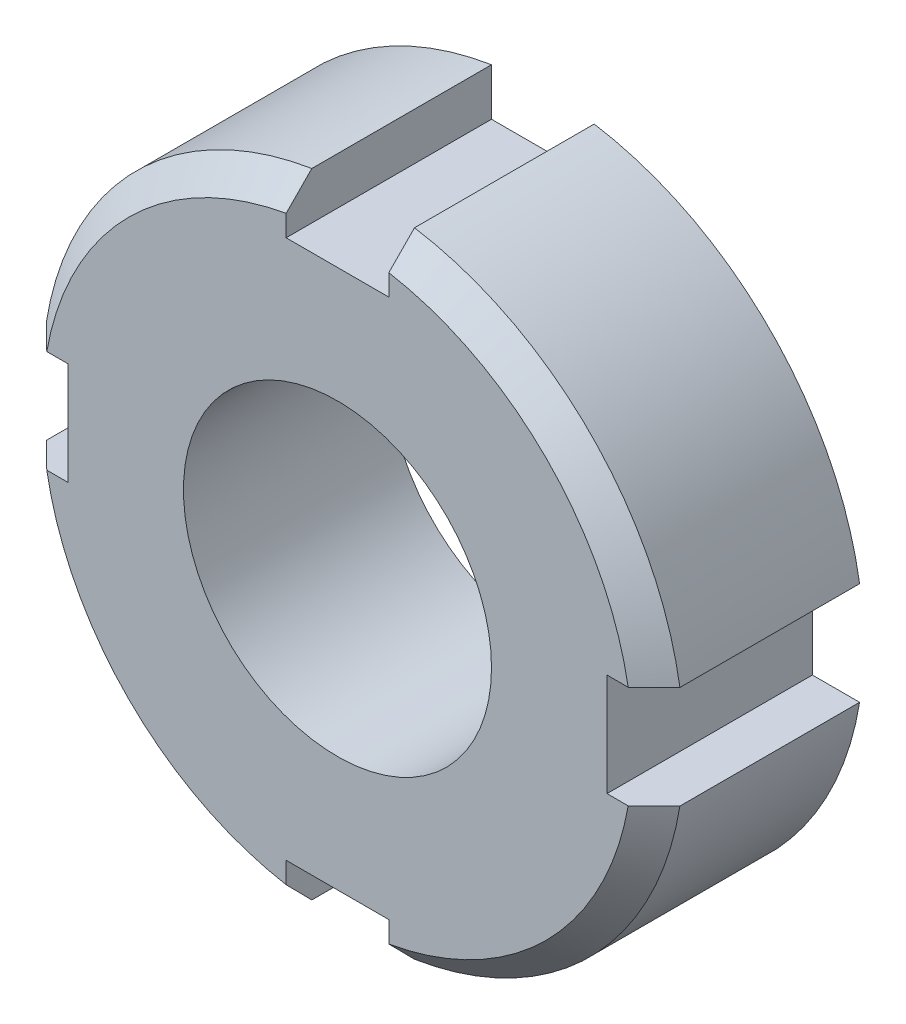
ISO-10303-21;
HEADER;
FILE_DESCRIPTION(('STEP AP214'),'2;1');
FILE_NAME('part.step','',(''),(''),'','','');
FILE_SCHEMA(('AUTOMOTIVE_DESIGN { 1 0 10303 214 1 1 1 1 }'));
ENDSEC;
DATA;
#1=APPLICATION_CONTEXT('core data for automotive mechanical design processes');
#2=APPLICATION_PROTOCOL_DEFINITION('international standard','automotive_design',2000,#1);
#3=PRODUCT_CONTEXT('',#1,'mechanical');
#4=PRODUCT('Part','Part','',(#3));
#5=PRODUCT_RELATED_PRODUCT_CATEGORY('part','',(#4));
#6=PRODUCT_DEFINITION_FORMATION('','',#4);
#7=PRODUCT_DEFINITION_CONTEXT('part definition',#1,'design');
#8=PRODUCT_DEFINITION('design','',#6,#7);
#9=PRODUCT_DEFINITION_SHAPE('','',#8);
#10=(LENGTH_UNIT() NAMED_UNIT(*) SI_UNIT(.MILLI.,.METRE.));
#11=(NAMED_UNIT(*) PLANE_ANGLE_UNIT() SI_UNIT($,.RADIAN.));
#12=(NAMED_UNIT(*) SI_UNIT($,.STERADIAN.) SOLID_ANGLE_UNIT());
#13=UNCERTAINTY_MEASURE_WITH_UNIT(LENGTH_MEASURE(1.E-05),#10,'distance_accuracy_value','');
#14=(GEOMETRIC_REPRESENTATION_CONTEXT(3) GLOBAL_UNCERTAINTY_ASSIGNED_CONTEXT((#13)) GLOBAL_UNIT_ASSIGNED_CONTEXT((#10,
#11,#12)) REPRESENTATION_CONTEXT('',''));
#15=CARTESIAN_POINT('',(0.,0.,0.));
#16=DIRECTION('',(0.,0.,1.));
#17=DIRECTION('',(1.,0.,0.));
#18=AXIS2_PLACEMENT_3D('',#15,#16,#17);
#19=CARTESIAN_POINT('',(0.,0.,8.));
#20=DIRECTION('',(0.,0.,-1.));
#21=DIRECTION('',(-1.,0.,0.));
#22=AXIS2_PLACEMENT_3D('',#19,#20,#21);
#23=CYLINDRICAL_SURFACE('',#22,12.5);
#24=DIRECTION('',(0.,0.,-1.));
#25=VECTOR('',#24,1.);
#26=CARTESIAN_POINT('',(-12.338962679253,2.00000000000013,8.));
#27=LINE('',#26,#25);
#28=CARTESIAN_POINT('',(-12.338962679253,2.00000000000013,0.));
#29=VERTEX_POINT('',#28);
#30=CARTESIAN_POINT('',(-12.338962679253,2.00000000000013,6.99999999999999));
#31=VERTEX_POINT('',#30);
#32=EDGE_CURVE('E190',#29,#31,#27,.F.);
#33=ORIENTED_EDGE('',*,*,#32,.T.);
#34=CARTESIAN_POINT('',(0.,0.,6.99999999999999));
#35=DIRECTION('',(0.,0.,1.));
#36=DIRECTION('',(1.,0.,0.));
#37=AXIS2_PLACEMENT_3D('',#34,#35,#36);
#38=CIRCLE('',#37,12.5);
#39=CARTESIAN_POINT('',(-2.,12.3389626792531,6.99999999999999));
#40=VERTEX_POINT('',#39);
#41=EDGE_CURVE('E48',#31,#40,#38,.F.);
#42=ORIENTED_EDGE('',*,*,#41,.T.);
#43=DIRECTION('',(0.,0.,-1.));
#44=VECTOR('',#43,1.);
#45=CARTESIAN_POINT('',(-2.,12.3389626792531,8.));
#46=LINE('',#45,#44);
#47=CARTESIAN_POINT('',(-2.,12.3389626792531,0.));
#48=VERTEX_POINT('',#47);
#49=EDGE_CURVE('E275',#40,#48,#46,.T.);
#50=ORIENTED_EDGE('',*,*,#49,.T.);
#51=CARTESIAN_POINT('',(0.,0.,0.));
#52=DIRECTION('',(0.,0.,1.));
#53=DIRECTION('',(1.,0.,0.));
#54=AXIS2_PLACEMENT_3D('',#51,#52,#53);
#55=CIRCLE('',#54,12.5);
#56=EDGE_CURVE('E289',#48,#29,#55,.T.);
#57=ORIENTED_EDGE('',*,*,#56,.T.);
#58=EDGE_LOOP('',(#33,#42,#50,#57));
#59=FACE_BOUND('',#58,.T.);
#60=ADVANCED_FACE('F35',(#59),#23,.T.);
#61=DIRECTION('',(0.,0.,-1.));
#62=VECTOR('',#61,1.);
#63=CARTESIAN_POINT('',(-2.00000000000009,-12.3389626792531,8.));
#64=LINE('',#63,#62);
#65=CARTESIAN_POINT('',(-2.00000000000009,-12.3389626792531,0.));
#66=VERTEX_POINT('',#65);
#67=CARTESIAN_POINT('',(-2.00000000000009,-12.3389626792531,7.));
#68=VERTEX_POINT('',#67);
#69=EDGE_CURVE('E231',#66,#68,#64,.F.);
#70=ORIENTED_EDGE('',*,*,#69,.T.);
#71=CARTESIAN_POINT('',(0.,0.,7.));
#72=DIRECTION('',(0.,0.,1.));
#73=DIRECTION('',(1.,0.,0.));
#74=AXIS2_PLACEMENT_3D('',#71,#72,#73);
#75=CIRCLE('',#74,12.5);
#76=CARTESIAN_POINT('',(-12.3389626792531,-1.99999999999987,7.));
#77=VERTEX_POINT('',#76);
#78=EDGE_CURVE('E453',#68,#77,#75,.F.);
#79=ORIENTED_EDGE('',*,*,#78,.T.);
#80=DIRECTION('',(0.,0.,-1.));
#81=VECTOR('',#80,1.);
#82=CARTESIAN_POINT('',(-12.3389626792531,-1.99999999999987,8.));
#83=LINE('',#82,#81);
#84=CARTESIAN_POINT('',(-12.3389626792531,-1.99999999999987,0.));
#85=VERTEX_POINT('',#84);
#86=EDGE_CURVE('E184',#77,#85,#83,.T.);
#87=ORIENTED_EDGE('',*,*,#86,.T.);
#88=EDGE_CURVE('E292',#85,#66,#55,.T.);
#89=ORIENTED_EDGE('',*,*,#88,.T.);
#90=EDGE_LOOP('',(#70,#79,#87,#89));
#91=FACE_BOUND('',#90,.T.);
#92=ADVANCED_FACE('F352',(#91),#23,.T.);
#93=DIRECTION('',(0.,0.,-1.));
#94=VECTOR('',#93,1.);
#95=CARTESIAN_POINT('',(12.3389626792531,-2.00000000000004,8.));
#96=LINE('',#95,#94);
#97=CARTESIAN_POINT('',(12.3389626792531,-2.00000000000004,0.));
#98=VERTEX_POINT('',#97);
#99=CARTESIAN_POINT('',(12.3389626792531,-2.00000000000004,7.));
#100=VERTEX_POINT('',#99);
#101=EDGE_CURVE('E255',#98,#100,#96,.F.);
#102=ORIENTED_EDGE('',*,*,#101,.T.);
#103=CARTESIAN_POINT('',(0.,0.,7.));
#104=DIRECTION('',(0.,0.,1.));
#105=DIRECTION('',(1.,0.,0.));
#106=AXIS2_PLACEMENT_3D('',#103,#104,#105);
#107=CIRCLE('',#106,12.5);
#108=CARTESIAN_POINT('',(1.99999999999991,-12.3389626792531,7.));
#109=VERTEX_POINT('',#108);
#110=EDGE_CURVE('E400',#100,#109,#107,.F.);
#111=ORIENTED_EDGE('',*,*,#110,.T.);
#112=DIRECTION('',(0.,0.,-1.));
#113=VECTOR('',#112,1.);
#114=CARTESIAN_POINT('',(1.99999999999991,-12.3389626792531,8.));
#115=LINE('',#114,#113);
#116=CARTESIAN_POINT('',(1.99999999999991,-12.3389626792531,0.));
#117=VERTEX_POINT('',#116);
#118=EDGE_CURVE('E227',#109,#117,#115,.T.);
#119=ORIENTED_EDGE('',*,*,#118,.T.);
#120=EDGE_CURVE('E457',#117,#98,#55,.T.);
#121=ORIENTED_EDGE('',*,*,#120,.T.);
#122=EDGE_LOOP('',(#102,#111,#119,#121));
#123=FACE_BOUND('',#122,.T.);
#124=ADVANCED_FACE('F347',(#123),#23,.T.);
#125=DIRECTION('',(0.,0.,-1.));
#126=VECTOR('',#125,1.);
#127=CARTESIAN_POINT('',(2.,12.3389626792531,8.));
#128=LINE('',#127,#126);
#129=CARTESIAN_POINT('',(2.,12.3389626792531,0.));
#130=VERTEX_POINT('',#129);
#131=CARTESIAN_POINT('',(2.,12.3389626792531,7.));
#132=VERTEX_POINT('',#131);
#133=EDGE_CURVE('E279',#130,#132,#128,.F.);
#134=ORIENTED_EDGE('',*,*,#133,.T.);
#135=CARTESIAN_POINT('',(0.,0.,7.));
#136=DIRECTION('',(0.,0.,1.));
#137=DIRECTION('',(1.,0.,0.));
#138=AXIS2_PLACEMENT_3D('',#135,#136,#137);
#139=CIRCLE('',#138,12.5);
#140=CARTESIAN_POINT('',(12.3389626792531,1.99999999999996,7.));
#141=VERTEX_POINT('',#140);
#142=EDGE_CURVE('E321',#132,#141,#139,.F.);
#143=ORIENTED_EDGE('',*,*,#142,.T.);
#144=DIRECTION('',(0.,0.,-1.));
#145=VECTOR('',#144,1.);
#146=CARTESIAN_POINT('',(12.3389626792531,1.99999999999996,8.));
#147=LINE('',#146,#145);
#148=CARTESIAN_POINT('',(12.3389626792531,1.99999999999996,0.));
#149=VERTEX_POINT('',#148);
#150=EDGE_CURVE('E251',#141,#149,#147,.T.);
#151=ORIENTED_EDGE('',*,*,#150,.T.);
#152=EDGE_CURVE('E286',#149,#130,#55,.T.);
#153=ORIENTED_EDGE('',*,*,#152,.T.);
#154=EDGE_LOOP('',(#134,#143,#151,#153));
#155=FACE_BOUND('',#154,.T.);
#156=ADVANCED_FACE('F342',(#155),#23,.T.);
#157=CARTESIAN_POINT('',(0.,0.,8.));
#158=DIRECTION('',(0.,0.,1.));
#159=DIRECTION('',(1.,0.,0.));
#160=AXIS2_PLACEMENT_3D('',#157,#158,#159);
#161=PLANE('',#160);
#162=DIRECTION('',(-1.,0.,0.));
#163=VECTOR('',#162,1.);
#164=CARTESIAN_POINT('',(14.5,1.99999999999995,8.));
#165=LINE('',#164,#163);
#166=CARTESIAN_POINT('',(11.3247516529061,1.99999999999996,8.));
#167=VERTEX_POINT('',#166);
#168=CARTESIAN_POINT('',(10.5,1.99999999999996,8.));
#169=VERTEX_POINT('',#168);
#170=EDGE_CURVE('E245',#167,#169,#165,.T.);
#171=ORIENTED_EDGE('',*,*,#170,.F.);
#172=CARTESIAN_POINT('',(0.,0.,8.));
#173=DIRECTION('',(0.,0.,1.));
#174=DIRECTION('',(1.,0.,0.));
#175=AXIS2_PLACEMENT_3D('',#172,#173,#174);
#176=CIRCLE('',#175,11.5);
#177=CARTESIAN_POINT('',(2.,11.3247516529061,8.));
#178=VERTEX_POINT('',#177);
#179=EDGE_CURVE('E311',#167,#178,#176,.T.);
#180=ORIENTED_EDGE('',*,*,#179,.T.);
#181=DIRECTION('',(0.,1.,0.));
#182=VECTOR('',#181,1.);
#183=CARTESIAN_POINT('',(2.,14.5,8.));
#184=LINE('',#183,#182);
#185=CARTESIAN_POINT('',(2.,10.5,8.));
#186=VERTEX_POINT('',#185);
#187=EDGE_CURVE('E258',#186,#178,#184,.T.);
#188=ORIENTED_EDGE('',*,*,#187,.F.);
#189=DIRECTION('',(1.,0.,0.));
#190=VECTOR('',#189,1.);
#191=CARTESIAN_POINT('',(-2.,10.5,8.));
#192=LINE('',#191,#190);
#193=CARTESIAN_POINT('',(-2.,10.5,8.));
#194=VERTEX_POINT('',#193);
#195=EDGE_CURVE('E263',#194,#186,#192,.T.);
#196=ORIENTED_EDGE('',*,*,#195,.F.);
#197=DIRECTION('',(0.,-1.,0.));
#198=VECTOR('',#197,1.);
#199=CARTESIAN_POINT('',(-2.,14.5,8.));
#200=LINE('',#199,#198);
#201=CARTESIAN_POINT('',(-2.,11.3247516529061,8.));
#202=VERTEX_POINT('',#201);
#203=EDGE_CURVE('E269',#202,#194,#200,.T.);
#204=ORIENTED_EDGE('',*,*,#203,.F.);
#205=CARTESIAN_POINT('',(0.,0.,8.));
#206=DIRECTION('',(0.,0.,1.));
#207=DIRECTION('',(1.,0.,0.));
#208=AXIS2_PLACEMENT_3D('',#205,#206,#207);
#209=CIRCLE('',#208,11.5);
#210=CARTESIAN_POINT('',(-11.3247516529061,2.00000000000012,8.));
#211=VERTEX_POINT('',#210);
#212=EDGE_CURVE('E302',#202,#211,#209,.T.);
#213=ORIENTED_EDGE('',*,*,#212,.T.);
#214=DIRECTION('',(-1.,0.,0.));
#215=VECTOR('',#214,1.);
#216=CARTESIAN_POINT('',(-14.5,2.00000000000015,8.));
#217=LINE('',#216,#215);
#218=CARTESIAN_POINT('',(-10.5,2.00000000000011,8.));
#219=VERTEX_POINT('',#218);
#220=EDGE_CURVE('E203',#219,#211,#217,.T.);
#221=ORIENTED_EDGE('',*,*,#220,.F.);
#222=DIRECTION('',(0.,1.,0.));
#223=VECTOR('',#222,1.);
#224=CARTESIAN_POINT('',(-10.5,-1.99999999999989,8.));
#225=LINE('',#224,#223);
#226=CARTESIAN_POINT('',(-10.5,-1.99999999999989,8.));
#227=VERTEX_POINT('',#226);
#228=EDGE_CURVE('E182',#227,#219,#225,.T.);
#229=ORIENTED_EDGE('',*,*,#228,.F.);
#230=DIRECTION('',(1.,0.,0.));
#231=VECTOR('',#230,1.);
#232=CARTESIAN_POINT('',(-14.5,-1.99999999999985,8.));
#233=LINE('',#232,#231);
#234=CARTESIAN_POINT('',(-11.3247516529061,-1.99999999999988,8.));
#235=VERTEX_POINT('',#234);
#236=EDGE_CURVE('E205',#235,#227,#233,.T.);
#237=ORIENTED_EDGE('',*,*,#236,.F.);
#238=CARTESIAN_POINT('',(0.,0.,8.));
#239=DIRECTION('',(0.,0.,1.));
#240=DIRECTION('',(1.,0.,0.));
#241=AXIS2_PLACEMENT_3D('',#238,#239,#240);
#242=CIRCLE('',#241,11.5);
#243=CARTESIAN_POINT('',(-2.00000000000008,-11.3247516529061,8.));
#244=VERTEX_POINT('',#243);
#245=EDGE_CURVE('E305',#235,#244,#242,.T.);
#246=ORIENTED_EDGE('',*,*,#245,.T.);
#247=DIRECTION('',(0.,-1.,0.));
#248=VECTOR('',#247,1.);
#249=CARTESIAN_POINT('',(-2.0000000000001,-14.5,8.));
#250=LINE('',#249,#248);
#251=CARTESIAN_POINT('',(-2.00000000000007,-10.5,8.));
#252=VERTEX_POINT('',#251);
#253=EDGE_CURVE('E210',#252,#244,#250,.T.);
#254=ORIENTED_EDGE('',*,*,#253,.F.);
#255=DIRECTION('',(-1.,0.,0.));
#256=VECTOR('',#255,1.);
#257=CARTESIAN_POINT('',(1.99999999999993,-10.5,8.));
#258=LINE('',#257,#256);
#259=CARTESIAN_POINT('',(1.99999999999993,-10.5,8.));
#260=VERTEX_POINT('',#259);
#261=EDGE_CURVE('E215',#260,#252,#258,.T.);
#262=ORIENTED_EDGE('',*,*,#261,.F.);
#263=DIRECTION('',(0.,1.,0.));
#264=VECTOR('',#263,1.);
#265=CARTESIAN_POINT('',(1.9999999999999,-14.5,8.));
#266=LINE('',#265,#264);
#267=CARTESIAN_POINT('',(1.99999999999992,-11.3247516529061,8.));
#268=VERTEX_POINT('',#267);
#269=EDGE_CURVE('E221',#268,#260,#266,.T.);
#270=ORIENTED_EDGE('',*,*,#269,.F.);
#271=CARTESIAN_POINT('',(0.,0.,8.));
#272=DIRECTION('',(0.,0.,1.));
#273=DIRECTION('',(1.,0.,0.));
#274=AXIS2_PLACEMENT_3D('',#271,#272,#273);
#275=CIRCLE('',#274,11.5);
#276=CARTESIAN_POINT('',(11.3247516529061,-2.00000000000004,8.));
#277=VERTEX_POINT('',#276);
#278=EDGE_CURVE('E308',#268,#277,#275,.T.);
#279=ORIENTED_EDGE('',*,*,#278,.T.);
#280=DIRECTION('',(1.,0.,0.));
#281=VECTOR('',#280,1.);
#282=CARTESIAN_POINT('',(14.5,-2.00000000000005,8.));
#283=LINE('',#282,#281);
#284=CARTESIAN_POINT('',(10.5,-2.00000000000004,8.));
#285=VERTEX_POINT('',#284);
#286=EDGE_CURVE('E234',#285,#277,#283,.T.);
#287=ORIENTED_EDGE('',*,*,#286,.F.);
#288=DIRECTION('',(0.,-1.,0.));
#289=VECTOR('',#288,1.);
#290=CARTESIAN_POINT('',(10.5,1.99999999999996,8.));
#291=LINE('',#290,#289);
#292=EDGE_CURVE('E239',#169,#285,#291,.T.);
#293=ORIENTED_EDGE('',*,*,#292,.F.);
#294=EDGE_LOOP('',(#171,#180,#188,#196,#204,#213,#221,#229,#237,#246,#254,#262,#270,#279,#287,#293));
#295=FACE_BOUND('',#294,.T.);
#296=CARTESIAN_POINT('',(0.,0.,8.));
#297=DIRECTION('',(0.,0.,1.));
#298=DIRECTION('',(1.,0.,0.));
#299=AXIS2_PLACEMENT_3D('',#296,#297,#298);
#300=CIRCLE('',#299,6.);
#301=CARTESIAN_POINT('',(6.,0.,8.));
#302=VERTEX_POINT('',#301);
#303=EDGE_CURVE('E282',#302,#302,#300,.T.);
#304=ORIENTED_EDGE('',*,*,#303,.F.);
#305=EDGE_LOOP('',(#304));
#306=FACE_BOUND('',#305,.T.);
#307=ADVANCED_FACE('F339',(#295,#306),#161,.T.);
#308=CARTESIAN_POINT('',(0.,0.,0.));
#309=DIRECTION('',(0.,0.,1.));
#310=DIRECTION('',(1.,0.,0.));
#311=AXIS2_PLACEMENT_3D('',#308,#309,#310);
#312=PLANE('',#311);
#313=CARTESIAN_POINT('',(0.,0.,0.));
#314=DIRECTION('',(0.,0.,1.));
#315=DIRECTION('',(1.,0.,0.));
#316=AXIS2_PLACEMENT_3D('',#313,#314,#315);
#317=CIRCLE('',#316,6.);
#318=CARTESIAN_POINT('',(6.,0.,0.));
#319=VERTEX_POINT('',#318);
#320=EDGE_CURVE('E283',#319,#319,#317,.T.);
#321=ORIENTED_EDGE('',*,*,#320,.T.);
#322=EDGE_LOOP('',(#321));
#323=FACE_BOUND('',#322,.T.);
#324=DIRECTION('',(0.,1.,0.));
#325=VECTOR('',#324,1.);
#326=CARTESIAN_POINT('',(-10.5,-1.99999999999989,0.));
#327=LINE('',#326,#325);
#328=CARTESIAN_POINT('',(-10.5,-1.99999999999989,0.));
#329=VERTEX_POINT('',#328);
#330=CARTESIAN_POINT('',(-10.5,2.00000000000011,0.));
#331=VERTEX_POINT('',#330);
#332=EDGE_CURVE('E179',#329,#331,#327,.T.);
#333=ORIENTED_EDGE('',*,*,#332,.T.);
#334=DIRECTION('',(-1.,0.,0.));
#335=VECTOR('',#334,1.);
#336=CARTESIAN_POINT('',(-14.5,2.00000000000015,0.));
#337=LINE('',#336,#335);
#338=EDGE_CURVE('E188',#331,#29,#337,.T.);
#339=ORIENTED_EDGE('',*,*,#338,.T.);
#340=ORIENTED_EDGE('',*,*,#56,.F.);
#341=DIRECTION('',(0.,-1.,0.));
#342=VECTOR('',#341,1.);
#343=CARTESIAN_POINT('',(-2.,0.,0.));
#344=LINE('',#343,#342);
#345=CARTESIAN_POINT('',(-2.,10.5,0.));
#346=VERTEX_POINT('',#345);
#347=EDGE_CURVE('E291',#48,#346,#344,.T.);
#348=ORIENTED_EDGE('',*,*,#347,.T.);
#349=DIRECTION('',(1.,0.,0.));
#350=VECTOR('',#349,1.);
#351=CARTESIAN_POINT('',(-2.,10.5,0.));
#352=LINE('',#351,#350);
#353=CARTESIAN_POINT('',(2.,10.5,0.));
#354=VERTEX_POINT('',#353);
#355=EDGE_CURVE('E262',#346,#354,#352,.T.);
#356=ORIENTED_EDGE('',*,*,#355,.T.);
#357=DIRECTION('',(0.,1.,0.));
#358=VECTOR('',#357,1.);
#359=CARTESIAN_POINT('',(2.,14.5,0.));
#360=LINE('',#359,#358);
#361=EDGE_CURVE('E259',#354,#130,#360,.T.);
#362=ORIENTED_EDGE('',*,*,#361,.T.);
#363=ORIENTED_EDGE('',*,*,#152,.F.);
#364=DIRECTION('',(-1.,0.,0.));
#365=VECTOR('',#364,1.);
#366=CARTESIAN_POINT('',(0.,2.,0.));
#367=LINE('',#366,#365);
#368=CARTESIAN_POINT('',(10.5,1.99999999999996,0.));
#369=VERTEX_POINT('',#368);
#370=EDGE_CURVE('E295',#149,#369,#367,.T.);
#371=ORIENTED_EDGE('',*,*,#370,.T.);
#372=DIRECTION('',(0.,-1.,0.));
#373=VECTOR('',#372,1.);
#374=CARTESIAN_POINT('',(10.5,1.99999999999996,0.));
#375=LINE('',#374,#373);
#376=CARTESIAN_POINT('',(10.5,-2.00000000000004,0.));
#377=VERTEX_POINT('',#376);
#378=EDGE_CURVE('E238',#369,#377,#375,.T.);
#379=ORIENTED_EDGE('',*,*,#378,.T.);
#380=DIRECTION('',(1.,0.,0.));
#381=VECTOR('',#380,1.);
#382=CARTESIAN_POINT('',(14.5,-2.00000000000005,0.));
#383=LINE('',#382,#381);
#384=EDGE_CURVE('E235',#377,#98,#383,.T.);
#385=ORIENTED_EDGE('',*,*,#384,.T.);
#386=ORIENTED_EDGE('',*,*,#120,.F.);
#387=DIRECTION('',(0.,1.,0.));
#388=VECTOR('',#387,1.);
#389=CARTESIAN_POINT('',(2.,0.,0.));
#390=LINE('',#389,#388);
#391=CARTESIAN_POINT('',(1.99999999999993,-10.5,0.));
#392=VERTEX_POINT('',#391);
#393=EDGE_CURVE('E298',#117,#392,#390,.T.);
#394=ORIENTED_EDGE('',*,*,#393,.T.);
#395=DIRECTION('',(-1.,0.,0.));
#396=VECTOR('',#395,1.);
#397=CARTESIAN_POINT('',(1.99999999999993,-10.5,0.));
#398=LINE('',#397,#396);
#399=CARTESIAN_POINT('',(-2.00000000000007,-10.5,0.));
#400=VERTEX_POINT('',#399);
#401=EDGE_CURVE('E214',#392,#400,#398,.T.);
#402=ORIENTED_EDGE('',*,*,#401,.T.);
#403=DIRECTION('',(0.,-1.,0.));
#404=VECTOR('',#403,1.);
#405=CARTESIAN_POINT('',(-2.0000000000001,-14.5,0.));
#406=LINE('',#405,#404);
#407=EDGE_CURVE('E211',#400,#66,#406,.T.);
#408=ORIENTED_EDGE('',*,*,#407,.T.);
#409=ORIENTED_EDGE('',*,*,#88,.F.);
#410=DIRECTION('',(1.,0.,0.));
#411=VECTOR('',#410,1.);
#412=CARTESIAN_POINT('',(0.,-2.,0.));
#413=LINE('',#412,#411);
#414=EDGE_CURVE('E199',#85,#329,#413,.T.);
#415=ORIENTED_EDGE('',*,*,#414,.T.);
#416=EDGE_LOOP('',(#333,#339,#340,#348,#356,#362,#363,#371,#379,#385,#386,#394,#402,#408,#409,#415));
#417=FACE_BOUND('',#416,.T.);
#418=ADVANCED_FACE('F196',(#323,#417),#312,.F.);
#419=CARTESIAN_POINT('',(0.,0.,0.));
#420=DIRECTION('',(0.,0.,1.));
#421=DIRECTION('',(1.,0.,0.));
#422=AXIS2_PLACEMENT_3D('',#419,#420,#421);
#423=CYLINDRICAL_SURFACE('',#422,6.);
#424=ORIENTED_EDGE('',*,*,#320,.F.);
#425=EDGE_LOOP('',(#424));
#426=FACE_BOUND('',#425,.T.);
#427=ORIENTED_EDGE('',*,*,#303,.T.);
#428=EDGE_LOOP('',(#427));
#429=FACE_BOUND('',#428,.T.);
#430=ADVANCED_FACE('F332',(#426,#429),#423,.F.);
#431=CARTESIAN_POINT('',(2.,14.5,0.));
#432=DIRECTION('',(1.,0.,0.));
#433=DIRECTION('',(0.,1.,0.));
#434=AXIS2_PLACEMENT_3D('',#431,#432,#433);
#435=PLANE('',#434);
#436=ORIENTED_EDGE('',*,*,#187,.T.);
#437=CARTESIAN_POINT('',(2.,11.3247516529061,8.));
#438=CARTESIAN_POINT('',(2.,11.493886203623,7.83343412402712));
#439=CARTESIAN_POINT('',(2.,11.6629710648232,7.66681785239852));
#440=CARTESIAN_POINT('',(2.,12.0010414069381,7.33348451906444));
#441=CARTESIAN_POINT('',(2.,12.1700268878536,7.1667674573597));
#442=CARTESIAN_POINT('',(2.,12.3389626792531,7.));
#443=B_SPLINE_CURVE_WITH_KNOTS('',3,(#437,#438,#439,#440,#441,#442),.UNSPECIFIED.,.F.,.F.,(4,2,
4),(0.,0.712148896177292,1.42429778707946),.UNSPECIFIED.);
#444=EDGE_CURVE('E314',#178,#132,#443,.T.);
#445=ORIENTED_EDGE('',*,*,#444,.T.);
#446=ORIENTED_EDGE('',*,*,#133,.F.);
#447=ORIENTED_EDGE('',*,*,#361,.F.);
#448=DIRECTION('',(0.,0.,1.));
#449=VECTOR('',#448,1.);
#450=CARTESIAN_POINT('',(2.,10.5,0.));
#451=LINE('',#450,#449);
#452=EDGE_CURVE('E273',#354,#186,#451,.T.);
#453=ORIENTED_EDGE('',*,*,#452,.T.);
#454=EDGE_LOOP('',(#436,#445,#446,#447,#453));
#455=FACE_BOUND('',#454,.T.);
#456=ADVANCED_FACE('F327',(#455),#435,.F.);
#457=CARTESIAN_POINT('',(-2.,14.5,0.));
#458=DIRECTION('',(-1.,0.,0.));
#459=DIRECTION('',(0.,-1.,0.));
#460=AXIS2_PLACEMENT_3D('',#457,#458,#459);
#461=PLANE('',#460);
#462=ORIENTED_EDGE('',*,*,#49,.F.);
#463=CARTESIAN_POINT('',(-2.,12.3389626792531,6.99999999999999));
#464=CARTESIAN_POINT('',(-2.,12.1700268878536,7.1667674573597));
#465=CARTESIAN_POINT('',(-2.,12.0010414069381,7.33348451906443));
#466=CARTESIAN_POINT('',(-2.,11.6629710648232,7.66681785239851));
#467=CARTESIAN_POINT('',(-2.,11.493886203623,7.83343412402712));
#468=CARTESIAN_POINT('',(-2.,11.3247516529061,8.));
#469=B_SPLINE_CURVE_WITH_KNOTS('',3,(#463,#464,#465,#466,#467,#468),.UNSPECIFIED.,.F.,.F.,(4,2,
4),(0.,0.712148890902175,1.42429778707947),.UNSPECIFIED.);
#470=EDGE_CURVE('E11',#40,#202,#469,.T.);
#471=ORIENTED_EDGE('',*,*,#470,.T.);
#472=ORIENTED_EDGE('',*,*,#203,.T.);
#473=DIRECTION('',(0.,0.,1.));
#474=VECTOR('',#473,1.);
#475=CARTESIAN_POINT('',(-2.,10.5,0.));
#476=LINE('',#475,#474);
#477=EDGE_CURVE('E266',#346,#194,#476,.T.);
#478=ORIENTED_EDGE('',*,*,#477,.F.);
#479=ORIENTED_EDGE('',*,*,#347,.F.);
#480=EDGE_LOOP('',(#462,#471,#472,#478,#479));
#481=FACE_BOUND('',#480,.T.);
#482=ADVANCED_FACE('F331',(#481),#461,.F.);
#483=CARTESIAN_POINT('',(-2.,10.5,0.));
#484=DIRECTION('',(0.,-1.,0.));
#485=DIRECTION('',(0.,0.,-1.));
#486=AXIS2_PLACEMENT_3D('',#483,#484,#485);
#487=PLANE('',#486);
#488=ORIENTED_EDGE('',*,*,#195,.T.);
#489=ORIENTED_EDGE('',*,*,#452,.F.);
#490=ORIENTED_EDGE('',*,*,#355,.F.);
#491=ORIENTED_EDGE('',*,*,#477,.T.);
#492=EDGE_LOOP('',(#488,#489,#490,#491));
#493=FACE_BOUND('',#492,.T.);
#494=ADVANCED_FACE('F426',(#493),#487,.F.);
#495=CARTESIAN_POINT('',(14.5,-2.00000000000005,0.));
#496=DIRECTION('',(0.,-1.,0.));
#497=DIRECTION('',(1.,0.,0.));
#498=AXIS2_PLACEMENT_3D('',#495,#496,#497);
#499=PLANE('',#498);
#500=ORIENTED_EDGE('',*,*,#286,.T.);
#501=CARTESIAN_POINT('',(11.3247516529061,-2.00000000000004,8.));
#502=CARTESIAN_POINT('',(11.493886203623,-2.00000000000004,7.83343412402712));
#503=CARTESIAN_POINT('',(11.6629710648232,-2.00000000000004,7.66681785239852));
#504=CARTESIAN_POINT('',(12.0010414069381,-2.00000000000004,7.33348451906444));
#505=CARTESIAN_POINT('',(12.1700268878536,-2.00000000000004,7.1667674573597));
#506=CARTESIAN_POINT('',(12.3389626792531,-2.00000000000004,7.));
#507=B_SPLINE_CURVE_WITH_KNOTS('',3,(#501,#502,#503,#504,#505,#506),.UNSPECIFIED.,.F.,.F.,(4,2,
4),(0.,0.712148896177287,1.42429778707946),.UNSPECIFIED.);
#508=EDGE_CURVE('E412',#277,#100,#507,.T.);
#509=ORIENTED_EDGE('',*,*,#508,.T.);
#510=ORIENTED_EDGE('',*,*,#101,.F.);
#511=ORIENTED_EDGE('',*,*,#384,.F.);
#512=DIRECTION('',(0.,0.,1.));
#513=VECTOR('',#512,1.);
#514=CARTESIAN_POINT('',(10.5,-2.00000000000004,0.));
#515=LINE('',#514,#513);
#516=EDGE_CURVE('E249',#377,#285,#515,.T.);
#517=ORIENTED_EDGE('',*,*,#516,.T.);
#518=EDGE_LOOP('',(#500,#509,#510,#511,#517));
#519=FACE_BOUND('',#518,.T.);
#520=ADVANCED_FACE('F422',(#519),#499,.F.);
#521=CARTESIAN_POINT('',(14.5,1.99999999999995,0.));
#522=DIRECTION('',(0.,1.,0.));
#523=DIRECTION('',(-1.,0.,0.));
#524=AXIS2_PLACEMENT_3D('',#521,#522,#523);
#525=PLANE('',#524);
#526=ORIENTED_EDGE('',*,*,#150,.F.);
#527=CARTESIAN_POINT('',(12.3389626792531,1.99999999999996,7.));
#528=CARTESIAN_POINT('',(12.1700268878536,1.99999999999996,7.1667674573597));
#529=CARTESIAN_POINT('',(12.0010414069381,1.99999999999996,7.33348451906444));
#530=CARTESIAN_POINT('',(11.6629710648232,1.99999999999996,7.66681785239852));
#531=CARTESIAN_POINT('',(11.493886203623,1.99999999999996,7.83343412402712));
#532=CARTESIAN_POINT('',(11.3247516529061,1.99999999999996,8.));
#533=B_SPLINE_CURVE_WITH_KNOTS('',3,(#527,#528,#529,#530,#531,#532),.UNSPECIFIED.,.F.,.F.,(4,2,
4),(0.,0.712148890902173,1.42429778707946),.UNSPECIFIED.);
#534=EDGE_CURVE('E417',#141,#167,#533,.T.);
#535=ORIENTED_EDGE('',*,*,#534,.T.);
#536=ORIENTED_EDGE('',*,*,#170,.T.);
#537=DIRECTION('',(0.,0.,1.));
#538=VECTOR('',#537,1.);
#539=CARTESIAN_POINT('',(10.5,1.99999999999996,0.));
#540=LINE('',#539,#538);
#541=EDGE_CURVE('E242',#369,#169,#540,.T.);
#542=ORIENTED_EDGE('',*,*,#541,.F.);
#543=ORIENTED_EDGE('',*,*,#370,.F.);
#544=EDGE_LOOP('',(#526,#535,#536,#542,#543));
#545=FACE_BOUND('',#544,.T.);
#546=ADVANCED_FACE('F425',(#545),#525,.F.);
#547=CARTESIAN_POINT('',(10.5,1.99999999999996,0.));
#548=DIRECTION('',(-1.,0.,0.));
#549=DIRECTION('',(0.,-1.,0.));
#550=AXIS2_PLACEMENT_3D('',#547,#548,#549);
#551=PLANE('',#550);
#552=ORIENTED_EDGE('',*,*,#292,.T.);
#553=ORIENTED_EDGE('',*,*,#516,.F.);
#554=ORIENTED_EDGE('',*,*,#378,.F.);
#555=ORIENTED_EDGE('',*,*,#541,.T.);
#556=EDGE_LOOP('',(#552,#553,#554,#555));
#557=FACE_BOUND('',#556,.T.);
#558=ADVANCED_FACE('F479',(#557),#551,.F.);
#559=CARTESIAN_POINT('',(-2.0000000000001,-14.5,0.));
#560=DIRECTION('',(-1.,0.,0.));
#561=DIRECTION('',(0.,-1.,0.));
#562=AXIS2_PLACEMENT_3D('',#559,#560,#561);
#563=PLANE('',#562);
#564=ORIENTED_EDGE('',*,*,#253,.T.);
#565=CARTESIAN_POINT('',(-2.00000000000008,-11.3247516529061,8.));
#566=CARTESIAN_POINT('',(-2.00000000000008,-11.493886203623,7.83343412402712));
#567=CARTESIAN_POINT('',(-2.00000000000008,-11.6629710648232,7.66681785239852));
#568=CARTESIAN_POINT('',(-2.00000000000009,-12.0010414069381,7.33348451906444));
#569=CARTESIAN_POINT('',(-2.00000000000009,-12.1700268878535,7.1667674573597));
#570=CARTESIAN_POINT('',(-2.00000000000009,-12.3389626792531,7.));
#571=B_SPLINE_CURVE_WITH_KNOTS('',3,(#565,#566,#567,#568,#569,#570),.UNSPECIFIED.,.F.,.F.,(4,2,
4),(0.,0.712148896177289,1.42429778707946),.UNSPECIFIED.);
#572=EDGE_CURVE('E399',#244,#68,#571,.T.);
#573=ORIENTED_EDGE('',*,*,#572,.T.);
#574=ORIENTED_EDGE('',*,*,#69,.F.);
#575=ORIENTED_EDGE('',*,*,#407,.F.);
#576=DIRECTION('',(0.,0.,1.));
#577=VECTOR('',#576,1.);
#578=CARTESIAN_POINT('',(-2.00000000000007,-10.5,0.));
#579=LINE('',#578,#577);
#580=EDGE_CURVE('E225',#400,#252,#579,.T.);
#581=ORIENTED_EDGE('',*,*,#580,.T.);
#582=EDGE_LOOP('',(#564,#573,#574,#575,#581));
#583=FACE_BOUND('',#582,.T.);
#584=ADVANCED_FACE('F388',(#583),#563,.F.);
#585=CARTESIAN_POINT('',(1.9999999999999,-14.5,0.));
#586=DIRECTION('',(1.,0.,0.));
#587=DIRECTION('',(0.,1.,0.));
#588=AXIS2_PLACEMENT_3D('',#585,#586,#587);
#589=PLANE('',#588);
#590=ORIENTED_EDGE('',*,*,#118,.F.);
#591=CARTESIAN_POINT('',(1.99999999999991,-12.3389626792531,7.));
#592=CARTESIAN_POINT('',(1.99999999999991,-12.1700268878536,7.1667674573597));
#593=CARTESIAN_POINT('',(1.99999999999991,-12.0010414069381,7.33348451906444));
#594=CARTESIAN_POINT('',(1.99999999999992,-11.6629710648232,7.66681785239852));
#595=CARTESIAN_POINT('',(1.99999999999992,-11.493886203623,7.83343412402712));
#596=CARTESIAN_POINT('',(1.99999999999992,-11.3247516529061,8.));
#597=B_SPLINE_CURVE_WITH_KNOTS('',3,(#591,#592,#593,#594,#595,#596),.UNSPECIFIED.,.F.,.F.,(4,2,
4),(0.,0.712148890902169,1.42429778707946),.UNSPECIFIED.);
#598=EDGE_CURVE('E393',#109,#268,#597,.T.);
#599=ORIENTED_EDGE('',*,*,#598,.T.);
#600=ORIENTED_EDGE('',*,*,#269,.T.);
#601=DIRECTION('',(0.,0.,1.));
#602=VECTOR('',#601,1.);
#603=CARTESIAN_POINT('',(1.99999999999993,-10.5,0.));
#604=LINE('',#603,#602);
#605=EDGE_CURVE('E218',#392,#260,#604,.T.);
#606=ORIENTED_EDGE('',*,*,#605,.F.);
#607=ORIENTED_EDGE('',*,*,#393,.F.);
#608=EDGE_LOOP('',(#590,#599,#600,#606,#607));
#609=FACE_BOUND('',#608,.T.);
#610=ADVANCED_FACE('F383',(#609),#589,.F.);
#611=CARTESIAN_POINT('',(1.99999999999993,-10.5,0.));
#612=DIRECTION('',(0.,1.,0.));
#613=DIRECTION('',(-1.,0.,0.));
#614=AXIS2_PLACEMENT_3D('',#611,#612,#613);
#615=PLANE('',#614);
#616=ORIENTED_EDGE('',*,*,#261,.T.);
#617=ORIENTED_EDGE('',*,*,#580,.F.);
#618=ORIENTED_EDGE('',*,*,#401,.F.);
#619=ORIENTED_EDGE('',*,*,#605,.T.);
#620=EDGE_LOOP('',(#616,#617,#618,#619));
#621=FACE_BOUND('',#620,.T.);
#622=ADVANCED_FACE('F378',(#621),#615,.F.);
#623=CARTESIAN_POINT('',(-14.5,2.00000000000015,0.));
#624=DIRECTION('',(0.,1.,0.));
#625=DIRECTION('',(-1.,0.,0.));
#626=AXIS2_PLACEMENT_3D('',#623,#624,#625);
#627=PLANE('',#626);
#628=ORIENTED_EDGE('',*,*,#220,.T.);
#629=CARTESIAN_POINT('',(-11.3247516529061,2.00000000000012,8.));
#630=CARTESIAN_POINT('',(-11.493886203623,2.00000000000012,7.83343412402712));
#631=CARTESIAN_POINT('',(-11.6629710648232,2.00000000000012,7.66681785239851));
#632=CARTESIAN_POINT('',(-12.0010414069381,2.00000000000013,7.33348451906443));
#633=CARTESIAN_POINT('',(-12.1700268878535,2.00000000000013,7.16676745735969));
#634=CARTESIAN_POINT('',(-12.338962679253,2.00000000000013,6.99999999999999));
#635=B_SPLINE_CURVE_WITH_KNOTS('',3,(#629,#630,#631,#632,#633,#634),.UNSPECIFIED.,.F.,.F.,(4,2,
4),(0.,0.712148896177298,1.42429778707947),.UNSPECIFIED.);
#636=EDGE_CURVE('E62',#211,#31,#635,.T.);
#637=ORIENTED_EDGE('',*,*,#636,.T.);
#638=ORIENTED_EDGE('',*,*,#32,.F.);
#639=ORIENTED_EDGE('',*,*,#338,.F.);
#640=DIRECTION('',(0.,0.,1.));
#641=VECTOR('',#640,1.);
#642=CARTESIAN_POINT('',(-10.5,2.00000000000011,0.));
#643=LINE('',#642,#641);
#644=EDGE_CURVE('E174',#331,#219,#643,.T.);
#645=ORIENTED_EDGE('',*,*,#644,.T.);
#646=EDGE_LOOP('',(#628,#637,#638,#639,#645));
#647=FACE_BOUND('',#646,.T.);
#648=ADVANCED_FACE('F189',(#647),#627,.F.);
#649=CARTESIAN_POINT('',(-14.5,-1.99999999999985,0.));
#650=DIRECTION('',(0.,-1.,0.));
#651=DIRECTION('',(1.,0.,0.));
#652=AXIS2_PLACEMENT_3D('',#649,#650,#651);
#653=PLANE('',#652);
#654=ORIENTED_EDGE('',*,*,#86,.F.);
#655=CARTESIAN_POINT('',(-12.3389626792531,-1.99999999999987,7.));
#656=CARTESIAN_POINT('',(-12.1700268878536,-1.99999999999987,7.1667674573597));
#657=CARTESIAN_POINT('',(-12.0010414069381,-1.99999999999987,7.33348451906444));
#658=CARTESIAN_POINT('',(-11.6629710648232,-1.99999999999988,7.66681785239852));
#659=CARTESIAN_POINT('',(-11.493886203623,-1.99999999999988,7.83343412402712));
#660=CARTESIAN_POINT('',(-11.3247516529061,-1.99999999999988,8.));
#661=B_SPLINE_CURVE_WITH_KNOTS('',3,(#655,#656,#657,#658,#659,#660),.UNSPECIFIED.,.F.,.F.,(4,2,
4),(0.,0.712148890902167,1.42429778707946),.UNSPECIFIED.);
#662=EDGE_CURVE('E362',#77,#235,#661,.T.);
#663=ORIENTED_EDGE('',*,*,#662,.T.);
#664=ORIENTED_EDGE('',*,*,#236,.T.);
#665=DIRECTION('',(0.,0.,1.));
#666=VECTOR('',#665,1.);
#667=CARTESIAN_POINT('',(-10.5,-1.99999999999989,0.));
#668=LINE('',#667,#666);
#669=EDGE_CURVE('E185',#329,#227,#668,.T.);
#670=ORIENTED_EDGE('',*,*,#669,.F.);
#671=ORIENTED_EDGE('',*,*,#414,.F.);
#672=EDGE_LOOP('',(#654,#663,#664,#670,#671));
#673=FACE_BOUND('',#672,.T.);
#674=ADVANCED_FACE('F377',(#673),#653,.F.);
#675=CARTESIAN_POINT('',(-10.5,-1.99999999999989,0.));
#676=DIRECTION('',(1.,0.,0.));
#677=DIRECTION('',(0.,1.,0.));
#678=AXIS2_PLACEMENT_3D('',#675,#676,#677);
#679=PLANE('',#678);
#680=ORIENTED_EDGE('',*,*,#228,.T.);
#681=ORIENTED_EDGE('',*,*,#644,.F.);
#682=ORIENTED_EDGE('',*,*,#332,.F.);
#683=ORIENTED_EDGE('',*,*,#669,.T.);
#684=EDGE_LOOP('',(#680,#681,#682,#683));
#685=FACE_BOUND('',#684,.T.);
#686=ADVANCED_FACE('F176',(#685),#679,.F.);
#687=CARTESIAN_POINT('',(0.,0.,8.));
#688=DIRECTION('',(0.,0.,-1.));
#689=DIRECTION('',(-1.,0.,0.));
#690=AXIS2_PLACEMENT_3D('',#687,#688,#689);
#691=CONICAL_SURFACE('',#690,11.5,0.78539816339745);
#692=ORIENTED_EDGE('',*,*,#534,.F.);
#693=ORIENTED_EDGE('',*,*,#142,.F.);
#694=ORIENTED_EDGE('',*,*,#444,.F.);
#695=ORIENTED_EDGE('',*,*,#179,.F.);
#696=EDGE_LOOP('',(#692,#693,#694,#695));
#697=FACE_BOUND('',#696,.T.);
#698=ADVANCED_FACE('F323',(#697),#691,.T.);
#699=CARTESIAN_POINT('',(0.,0.,8.));
#700=DIRECTION('',(0.,0.,-1.));
#701=DIRECTION('',(-1.,0.,0.));
#702=AXIS2_PLACEMENT_3D('',#699,#700,#701);
#703=CONICAL_SURFACE('',#702,11.5,0.785398163397446);
#704=ORIENTED_EDGE('',*,*,#598,.F.);
#705=ORIENTED_EDGE('',*,*,#110,.F.);
#706=ORIENTED_EDGE('',*,*,#508,.F.);
#707=ORIENTED_EDGE('',*,*,#278,.F.);
#708=EDGE_LOOP('',(#704,#705,#706,#707));
#709=FACE_BOUND('',#708,.T.);
#710=ADVANCED_FACE('F405',(#709),#703,.T.);
#711=CARTESIAN_POINT('',(0.,0.,8.));
#712=DIRECTION('',(0.,0.,-1.));
#713=DIRECTION('',(-1.,0.,0.));
#714=AXIS2_PLACEMENT_3D('',#711,#712,#713);
#715=CONICAL_SURFACE('',#714,11.5,0.785398163397448);
#716=ORIENTED_EDGE('',*,*,#662,.F.);
#717=ORIENTED_EDGE('',*,*,#78,.F.);
#718=ORIENTED_EDGE('',*,*,#572,.F.);
#719=ORIENTED_EDGE('',*,*,#245,.F.);
#720=EDGE_LOOP('',(#716,#717,#718,#719));
#721=FACE_BOUND('',#720,.T.);
#722=ADVANCED_FACE('F408',(#721),#715,.T.);
#723=CARTESIAN_POINT('',(0.,0.,8.));
#724=DIRECTION('',(0.,0.,-1.));
#725=DIRECTION('',(-1.,0.,0.));
#726=AXIS2_PLACEMENT_3D('',#723,#724,#725);
#727=CONICAL_SURFACE('',#726,11.5,0.785398163397447);
#728=ORIENTED_EDGE('',*,*,#470,.F.);
#729=ORIENTED_EDGE('',*,*,#41,.F.);
#730=ORIENTED_EDGE('',*,*,#636,.F.);
#731=ORIENTED_EDGE('',*,*,#212,.F.);
#732=EDGE_LOOP('',(#728,#729,#730,#731));
#733=FACE_BOUND('',#732,.T.);
#734=ADVANCED_FACE('F37',(#733),#727,.T.);
#735=CLOSED_SHELL('',(#60,#92,#124,#156,#307,#418,#430,#456,#482,#494,#520,#546,#558,#584,#610,
#622,#648,#674,#686,#698,#710,#722,#734));
#736=MANIFOLD_SOLID_BREP('B2',#735);
#737=ADVANCED_BREP_SHAPE_REPRESENTATION('',(#18,#736),#14);
#738=SHAPE_DEFINITION_REPRESENTATION(#9,#737);
ENDSEC;
END-ISO-10303-21;
